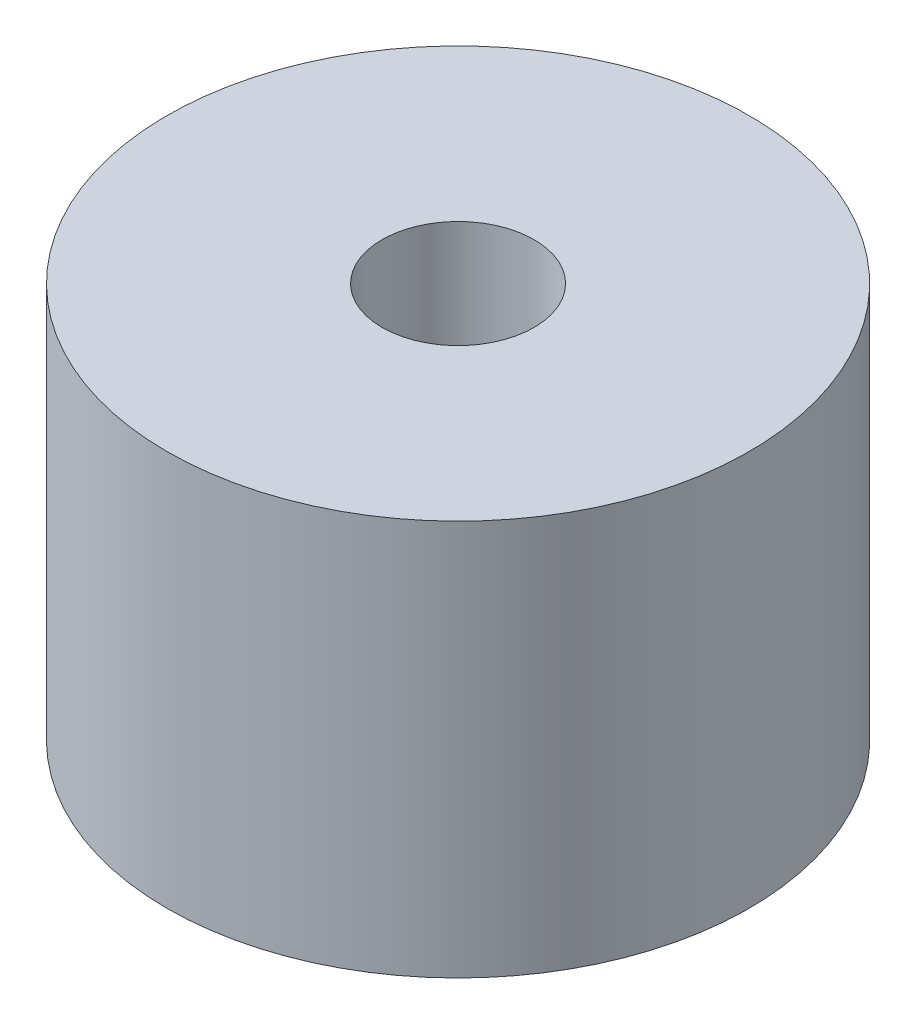
ISO-10303-21;
HEADER;
FILE_DESCRIPTION(('STEP AP214'),'2;1');
FILE_NAME('part.step','',(''),(''),'','','');
FILE_SCHEMA(('AUTOMOTIVE_DESIGN { 1 0 10303 214 1 1 1 1 }'));
ENDSEC;
DATA;
#1=APPLICATION_CONTEXT('core data for automotive mechanical design processes');
#2=APPLICATION_PROTOCOL_DEFINITION('international standard','automotive_design',2000,#1);
#3=PRODUCT_CONTEXT('',#1,'mechanical');
#4=PRODUCT('Part','Part','',(#3));
#5=PRODUCT_RELATED_PRODUCT_CATEGORY('part','',(#4));
#6=PRODUCT_DEFINITION_FORMATION('','',#4);
#7=PRODUCT_DEFINITION_CONTEXT('part definition',#1,'design');
#8=PRODUCT_DEFINITION('design','',#6,#7);
#9=PRODUCT_DEFINITION_SHAPE('','',#8);
#10=(LENGTH_UNIT() NAMED_UNIT(*) SI_UNIT(.MILLI.,.METRE.));
#11=(NAMED_UNIT(*) PLANE_ANGLE_UNIT() SI_UNIT($,.RADIAN.));
#12=(NAMED_UNIT(*) SI_UNIT($,.STERADIAN.) SOLID_ANGLE_UNIT());
#13=UNCERTAINTY_MEASURE_WITH_UNIT(LENGTH_MEASURE(1.E-05),#10,'distance_accuracy_value','');
#14=(GEOMETRIC_REPRESENTATION_CONTEXT(3) GLOBAL_UNCERTAINTY_ASSIGNED_CONTEXT((#13)) GLOBAL_UNIT_ASSIGNED_CONTEXT((#10,
#11,#12)) REPRESENTATION_CONTEXT('',''));
#15=CARTESIAN_POINT('',(0.,0.,0.));
#16=DIRECTION('',(0.,0.,1.));
#17=DIRECTION('',(1.,0.,0.));
#18=AXIS2_PLACEMENT_3D('',#15,#16,#17);
#19=CARTESIAN_POINT('',(0.,12.94765,0.));
#20=DIRECTION('',(0.,-1.,0.));
#21=DIRECTION('',(0.,0.,-1.));
#22=AXIS2_PLACEMENT_3D('',#19,#20,#21);
#23=CYLINDRICAL_SURFACE('',#22,9.525);
#24=CARTESIAN_POINT('',(0.,12.94765,0.));
#25=DIRECTION('',(0.,1.,0.));
#26=DIRECTION('',(0.,0.,1.));
#27=AXIS2_PLACEMENT_3D('',#24,#25,#26);
#28=CIRCLE('',#27,9.525);
#29=CARTESIAN_POINT('',(0.,12.94765,9.525));
#30=VERTEX_POINT('',#29);
#31=EDGE_CURVE('E10',#30,#30,#28,.T.);
#32=ORIENTED_EDGE('',*,*,#31,.F.);
#33=EDGE_LOOP('',(#32));
#34=FACE_BOUND('',#33,.T.);
#35=CARTESIAN_POINT('',(0.,0.,0.));
#36=DIRECTION('',(0.,1.,0.));
#37=DIRECTION('',(0.,0.,1.));
#38=AXIS2_PLACEMENT_3D('',#35,#36,#37);
#39=CIRCLE('',#38,9.525);
#40=CARTESIAN_POINT('',(0.,0.,9.525));
#41=VERTEX_POINT('',#40);
#42=EDGE_CURVE('E34',#41,#41,#39,.T.);
#43=ORIENTED_EDGE('',*,*,#42,.T.);
#44=EDGE_LOOP('',(#43));
#45=FACE_BOUND('',#44,.T.);
#46=ADVANCED_FACE('F31',(#34,#45),#23,.T.);
#47=CARTESIAN_POINT('',(0.,12.94765,0.));
#48=DIRECTION('',(0.,1.,0.));
#49=DIRECTION('',(0.,0.,1.));
#50=AXIS2_PLACEMENT_3D('',#47,#48,#49);
#51=PLANE('',#50);
#52=CARTESIAN_POINT('',(0.,12.94765,0.));
#53=DIRECTION('',(0.,1.,0.));
#54=DIRECTION('',(0.,0.,1.));
#55=AXIS2_PLACEMENT_3D('',#52,#53,#54);
#56=CIRCLE('',#55,2.48919999999999);
#57=CARTESIAN_POINT('',(0.,12.94765,2.48919999999999));
#58=VERTEX_POINT('',#57);
#59=EDGE_CURVE('E45',#58,#58,#56,.T.);
#60=ORIENTED_EDGE('',*,*,#59,.F.);
#61=EDGE_LOOP('',(#60));
#62=FACE_BOUND('',#61,.T.);
#63=ORIENTED_EDGE('',*,*,#31,.T.);
#64=EDGE_LOOP('',(#63));
#65=FACE_BOUND('',#64,.T.);
#66=ADVANCED_FACE('F51',(#62,#65),#51,.T.);
#67=CARTESIAN_POINT('',(0.,0.,0.));
#68=DIRECTION('',(0.,1.,0.));
#69=DIRECTION('',(0.,0.,1.));
#70=AXIS2_PLACEMENT_3D('',#67,#68,#69);
#71=PLANE('',#70);
#72=CARTESIAN_POINT('',(0.,0.,0.));
#73=DIRECTION('',(0.,1.,0.));
#74=DIRECTION('',(0.,0.,1.));
#75=AXIS2_PLACEMENT_3D('',#72,#73,#74);
#76=CIRCLE('',#75,2.4892);
#77=CARTESIAN_POINT('',(0.,0.,2.4892));
#78=VERTEX_POINT('',#77);
#79=EDGE_CURVE('E41',#78,#78,#76,.T.);
#80=ORIENTED_EDGE('',*,*,#79,.T.);
#81=EDGE_LOOP('',(#80));
#82=FACE_BOUND('',#81,.T.);
#83=ORIENTED_EDGE('',*,*,#42,.F.);
#84=EDGE_LOOP('',(#83));
#85=FACE_BOUND('',#84,.T.);
#86=ADVANCED_FACE('F53',(#82,#85),#71,.F.);
#87=CARTESIAN_POINT('',(0.,12.94765,0.));
#88=DIRECTION('',(0.,1.,0.));
#89=DIRECTION('',(0.,0.,1.));
#90=AXIS2_PLACEMENT_3D('',#87,#88,#89);
#91=CYLINDRICAL_SURFACE('',#90,2.48919999999999);
#92=ORIENTED_EDGE('',*,*,#79,.F.);
#93=EDGE_LOOP('',(#92));
#94=FACE_BOUND('',#93,.T.);
#95=ORIENTED_EDGE('',*,*,#59,.T.);
#96=EDGE_LOOP('',(#95));
#97=FACE_BOUND('',#96,.T.);
#98=ADVANCED_FACE('F49',(#94,#97),#91,.F.);
#99=CLOSED_SHELL('',(#46,#66,#86,#98));
#100=MANIFOLD_SOLID_BREP('B2',#99);
#101=ADVANCED_BREP_SHAPE_REPRESENTATION('',(#18,#100),#14);
#102=SHAPE_DEFINITION_REPRESENTATION(#9,#101);
ENDSEC;
END-ISO-10303-21;
